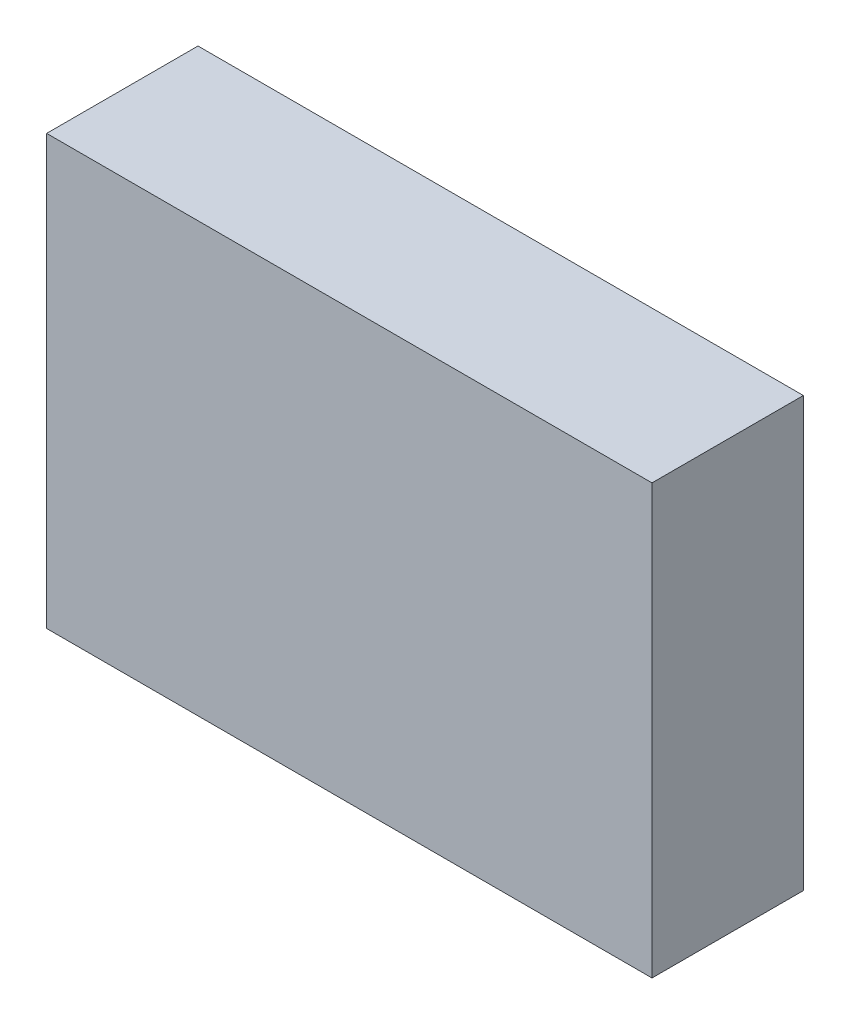
ISO-10303-21;
HEADER;
FILE_DESCRIPTION(('STEP AP214'),'2;1');
FILE_NAME('part.step','',(''),(''),'','','');
FILE_SCHEMA(('AUTOMOTIVE_DESIGN { 1 0 10303 214 1 1 1 1 }'));
ENDSEC;
DATA;
#1=APPLICATION_CONTEXT('core data for automotive mechanical design processes');
#2=APPLICATION_PROTOCOL_DEFINITION('international standard','automotive_design',2000,#1);
#3=PRODUCT_CONTEXT('',#1,'mechanical');
#4=PRODUCT('Part','Part','',(#3));
#5=PRODUCT_RELATED_PRODUCT_CATEGORY('part','',(#4));
#6=PRODUCT_DEFINITION_FORMATION('','',#4);
#7=PRODUCT_DEFINITION_CONTEXT('part definition',#1,'design');
#8=PRODUCT_DEFINITION('design','',#6,#7);
#9=PRODUCT_DEFINITION_SHAPE('','',#8);
#10=(LENGTH_UNIT() NAMED_UNIT(*) SI_UNIT(.MILLI.,.METRE.));
#11=(NAMED_UNIT(*) PLANE_ANGLE_UNIT() SI_UNIT($,.RADIAN.));
#12=(NAMED_UNIT(*) SI_UNIT($,.STERADIAN.) SOLID_ANGLE_UNIT());
#13=UNCERTAINTY_MEASURE_WITH_UNIT(LENGTH_MEASURE(1.E-05),#10,'distance_accuracy_value','');
#14=(GEOMETRIC_REPRESENTATION_CONTEXT(3) GLOBAL_UNCERTAINTY_ASSIGNED_CONTEXT((#13)) GLOBAL_UNIT_ASSIGNED_CONTEXT((#10,
#11,#12)) REPRESENTATION_CONTEXT('',''));
#15=CARTESIAN_POINT('',(0.,0.,0.));
#16=DIRECTION('',(0.,0.,1.));
#17=DIRECTION('',(1.,0.,0.));
#18=AXIS2_PLACEMENT_3D('',#15,#16,#17);
#19=CARTESIAN_POINT('',(-600.,-425.,300.));
#20=DIRECTION('',(0.,0.,1.));
#21=DIRECTION('',(1.,0.,0.));
#22=AXIS2_PLACEMENT_3D('',#19,#20,#21);
#23=PLANE('',#22);
#24=DIRECTION('',(0.,1.,0.));
#25=VECTOR('',#24,1.);
#26=CARTESIAN_POINT('',(-600.,-425.,300.));
#27=LINE('',#26,#25);
#28=CARTESIAN_POINT('',(-600.,-425.,300.));
#29=VERTEX_POINT('',#28);
#30=CARTESIAN_POINT('',(-600.,425.,300.));
#31=VERTEX_POINT('',#30);
#32=EDGE_CURVE('E90',#29,#31,#27,.T.);
#33=ORIENTED_EDGE('',*,*,#32,.F.);
#34=DIRECTION('',(1.,0.,0.));
#35=VECTOR('',#34,1.);
#36=CARTESIAN_POINT('',(-600.,-425.,300.));
#37=LINE('',#36,#35);
#38=CARTESIAN_POINT('',(600.,-425.,300.));
#39=VERTEX_POINT('',#38);
#40=EDGE_CURVE('E50',#29,#39,#37,.T.);
#41=ORIENTED_EDGE('',*,*,#40,.T.);
#42=DIRECTION('',(0.,1.,0.));
#43=VECTOR('',#42,1.);
#44=CARTESIAN_POINT('',(600.,-425.,300.));
#45=LINE('',#44,#43);
#46=CARTESIAN_POINT('',(600.,425.,300.));
#47=VERTEX_POINT('',#46);
#48=EDGE_CURVE('E84',#39,#47,#45,.T.);
#49=ORIENTED_EDGE('',*,*,#48,.T.);
#50=DIRECTION('',(1.,0.,0.));
#51=VECTOR('',#50,1.);
#52=CARTESIAN_POINT('',(-600.,425.,300.));
#53=LINE('',#52,#51);
#54=EDGE_CURVE('E11',#31,#47,#53,.T.);
#55=ORIENTED_EDGE('',*,*,#54,.F.);
#56=EDGE_LOOP('',(#33,#41,#49,#55));
#57=FACE_BOUND('',#56,.T.);
#58=ADVANCED_FACE('F17',(#57),#23,.T.);
#59=CARTESIAN_POINT('',(-600.,-425.,0.));
#60=DIRECTION('',(0.,0.,1.));
#61=DIRECTION('',(1.,0.,0.));
#62=AXIS2_PLACEMENT_3D('',#59,#60,#61);
#63=PLANE('',#62);
#64=DIRECTION('',(1.,0.,0.));
#65=VECTOR('',#64,1.);
#66=CARTESIAN_POINT('',(-600.,425.,0.));
#67=LINE('',#66,#65);
#68=CARTESIAN_POINT('',(-600.,425.,0.));
#69=VERTEX_POINT('',#68);
#70=CARTESIAN_POINT('',(600.,425.,0.));
#71=VERTEX_POINT('',#70);
#72=EDGE_CURVE('E21',#69,#71,#67,.T.);
#73=ORIENTED_EDGE('',*,*,#72,.T.);
#74=DIRECTION('',(0.,1.,0.));
#75=VECTOR('',#74,1.);
#76=CARTESIAN_POINT('',(600.,-425.,0.));
#77=LINE('',#76,#75);
#78=CARTESIAN_POINT('',(600.,-425.,0.));
#79=VERTEX_POINT('',#78);
#80=EDGE_CURVE('E104',#79,#71,#77,.T.);
#81=ORIENTED_EDGE('',*,*,#80,.F.);
#82=DIRECTION('',(1.,0.,0.));
#83=VECTOR('',#82,1.);
#84=CARTESIAN_POINT('',(-600.,-425.,0.));
#85=LINE('',#84,#83);
#86=CARTESIAN_POINT('',(-600.,-425.,0.));
#87=VERTEX_POINT('',#86);
#88=EDGE_CURVE('E60',#87,#79,#85,.T.);
#89=ORIENTED_EDGE('',*,*,#88,.F.);
#90=DIRECTION('',(0.,1.,0.));
#91=VECTOR('',#90,1.);
#92=CARTESIAN_POINT('',(-600.,-425.,0.));
#93=LINE('',#92,#91);
#94=EDGE_CURVE('E91',#87,#69,#93,.T.);
#95=ORIENTED_EDGE('',*,*,#94,.T.);
#96=EDGE_LOOP('',(#73,#81,#89,#95));
#97=FACE_BOUND('',#96,.T.);
#98=ADVANCED_FACE('F19',(#97),#63,.F.);
#99=CARTESIAN_POINT('',(-600.,425.,0.));
#100=DIRECTION('',(0.,1.,0.));
#101=DIRECTION('',(1.,0.,0.));
#102=AXIS2_PLACEMENT_3D('',#99,#100,#101);
#103=PLANE('',#102);
#104=ORIENTED_EDGE('',*,*,#72,.F.);
#105=DIRECTION('',(0.,0.,1.));
#106=VECTOR('',#105,1.);
#107=CARTESIAN_POINT('',(-600.,425.,0.));
#108=LINE('',#107,#106);
#109=EDGE_CURVE('E95',#69,#31,#108,.T.);
#110=ORIENTED_EDGE('',*,*,#109,.T.);
#111=ORIENTED_EDGE('',*,*,#54,.T.);
#112=DIRECTION('',(0.,0.,1.));
#113=VECTOR('',#112,1.);
#114=CARTESIAN_POINT('',(600.,425.,0.));
#115=LINE('',#114,#113);
#116=EDGE_CURVE('E109',#71,#47,#115,.T.);
#117=ORIENTED_EDGE('',*,*,#116,.F.);
#118=EDGE_LOOP('',(#104,#110,#111,#117));
#119=FACE_BOUND('',#118,.T.);
#120=ADVANCED_FACE('F119',(#119),#103,.T.);
#121=CARTESIAN_POINT('',(-600.,-425.,0.));
#122=DIRECTION('',(0.,1.,0.));
#123=DIRECTION('',(1.,0.,0.));
#124=AXIS2_PLACEMENT_3D('',#121,#122,#123);
#125=PLANE('',#124);
#126=DIRECTION('',(0.,0.,1.));
#127=VECTOR('',#126,1.);
#128=CARTESIAN_POINT('',(600.,-425.,0.));
#129=LINE('',#128,#127);
#130=EDGE_CURVE('E82',#79,#39,#129,.T.);
#131=ORIENTED_EDGE('',*,*,#130,.T.);
#132=ORIENTED_EDGE('',*,*,#40,.F.);
#133=DIRECTION('',(0.,0.,1.));
#134=VECTOR('',#133,1.);
#135=CARTESIAN_POINT('',(-600.,-425.,0.));
#136=LINE('',#135,#134);
#137=EDGE_CURVE('E79',#87,#29,#136,.T.);
#138=ORIENTED_EDGE('',*,*,#137,.F.);
#139=ORIENTED_EDGE('',*,*,#88,.T.);
#140=EDGE_LOOP('',(#131,#132,#138,#139));
#141=FACE_BOUND('',#140,.T.);
#142=ADVANCED_FACE('F78',(#141),#125,.F.);
#143=CARTESIAN_POINT('',(600.,-425.,0.));
#144=DIRECTION('',(1.,0.,0.));
#145=DIRECTION('',(0.,-1.,0.));
#146=AXIS2_PLACEMENT_3D('',#143,#144,#145);
#147=PLANE('',#146);
#148=ORIENTED_EDGE('',*,*,#130,.F.);
#149=ORIENTED_EDGE('',*,*,#80,.T.);
#150=ORIENTED_EDGE('',*,*,#116,.T.);
#151=ORIENTED_EDGE('',*,*,#48,.F.);
#152=EDGE_LOOP('',(#148,#149,#150,#151));
#153=FACE_BOUND('',#152,.T.);
#154=ADVANCED_FACE('F118',(#153),#147,.T.);
#155=CARTESIAN_POINT('',(-600.,-425.,0.));
#156=DIRECTION('',(1.,0.,0.));
#157=DIRECTION('',(0.,-1.,0.));
#158=AXIS2_PLACEMENT_3D('',#155,#156,#157);
#159=PLANE('',#158);
#160=ORIENTED_EDGE('',*,*,#32,.T.);
#161=ORIENTED_EDGE('',*,*,#109,.F.);
#162=ORIENTED_EDGE('',*,*,#94,.F.);
#163=ORIENTED_EDGE('',*,*,#137,.T.);
#164=EDGE_LOOP('',(#160,#161,#162,#163));
#165=FACE_BOUND('',#164,.T.);
#166=ADVANCED_FACE('F88',(#165),#159,.F.);
#167=CLOSED_SHELL('',(#58,#98,#120,#142,#154,#166));
#168=MANIFOLD_SOLID_BREP('B1',#167);
#169=ADVANCED_BREP_SHAPE_REPRESENTATION('',(#18,#168),#14);
#170=SHAPE_DEFINITION_REPRESENTATION(#9,#169);
ENDSEC;
END-ISO-10303-21;
